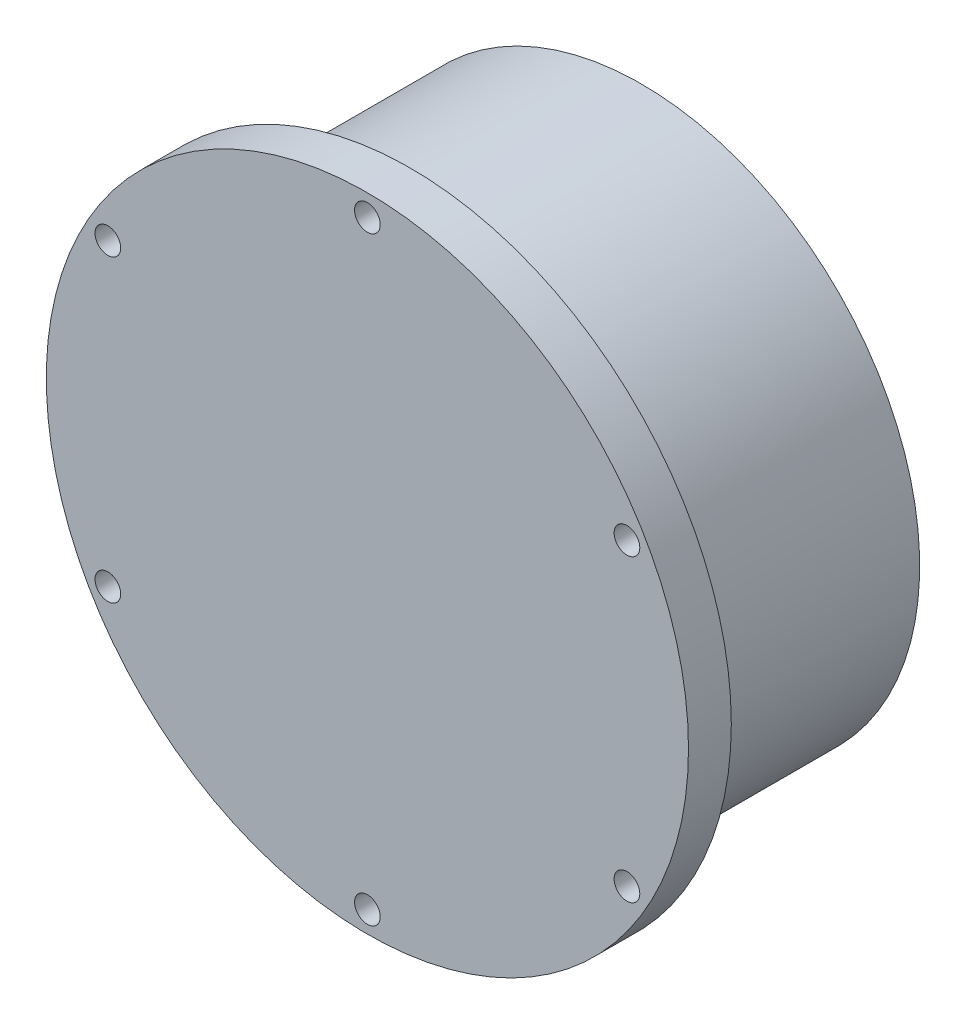
ISO-10303-21;
HEADER;
FILE_DESCRIPTION(('STEP AP214'),'2;1');
FILE_NAME('part.step','',(''),(''),'','','');
FILE_SCHEMA(('AUTOMOTIVE_DESIGN { 1 0 10303 214 1 1 1 1 }'));
ENDSEC;
DATA;
#1=APPLICATION_CONTEXT('core data for automotive mechanical design processes');
#2=APPLICATION_PROTOCOL_DEFINITION('international standard','automotive_design',2000,#1);
#3=PRODUCT_CONTEXT('',#1,'mechanical');
#4=PRODUCT('Part','Part','',(#3));
#5=PRODUCT_RELATED_PRODUCT_CATEGORY('part','',(#4));
#6=PRODUCT_DEFINITION_FORMATION('','',#4);
#7=PRODUCT_DEFINITION_CONTEXT('part definition',#1,'design');
#8=PRODUCT_DEFINITION('design','',#6,#7);
#9=PRODUCT_DEFINITION_SHAPE('','',#8);
#10=(LENGTH_UNIT() NAMED_UNIT(*) SI_UNIT(.MILLI.,.METRE.));
#11=(NAMED_UNIT(*) PLANE_ANGLE_UNIT() SI_UNIT($,.RADIAN.));
#12=(NAMED_UNIT(*) SI_UNIT($,.STERADIAN.) SOLID_ANGLE_UNIT());
#13=UNCERTAINTY_MEASURE_WITH_UNIT(LENGTH_MEASURE(1.E-05),#10,'distance_accuracy_value','');
#14=(GEOMETRIC_REPRESENTATION_CONTEXT(3) GLOBAL_UNCERTAINTY_ASSIGNED_CONTEXT((#13)) GLOBAL_UNIT_ASSIGNED_CONTEXT((#10,
#11,#12)) REPRESENTATION_CONTEXT('',''));
#15=CARTESIAN_POINT('',(0.,0.,0.));
#16=DIRECTION('',(0.,0.,1.));
#17=DIRECTION('',(1.,0.,0.));
#18=AXIS2_PLACEMENT_3D('',#15,#16,#17);
#19=CARTESIAN_POINT('',(0.,0.,5.));
#20=DIRECTION('',(0.,0.,1.));
#21=DIRECTION('',(1.,0.,0.));
#22=AXIS2_PLACEMENT_3D('',#19,#20,#21);
#23=PLANE('',#22);
#24=CARTESIAN_POINT('',(-30.3108891324529,-17.5000000000007,5.));
#25=DIRECTION('',(0.,0.,1.));
#26=DIRECTION('',(1.,0.,0.));
#27=AXIS2_PLACEMENT_3D('',#24,#25,#26);
#28=CIRCLE('',#27,1.5);
#29=CARTESIAN_POINT('',(-28.8108891324529,-17.5000000000007,5.));
#30=VERTEX_POINT('',#29);
#31=EDGE_CURVE('E71',#30,#30,#28,.T.);
#32=ORIENTED_EDGE('',*,*,#31,.F.);
#33=EDGE_LOOP('',(#32));
#34=FACE_BOUND('',#33,.T.);
#35=CARTESIAN_POINT('',(30.3108891324563,-17.4999999999984,5.));
#36=DIRECTION('',(0.,0.,1.));
#37=DIRECTION('',(1.,0.,0.));
#38=AXIS2_PLACEMENT_3D('',#35,#36,#37);
#39=CIRCLE('',#38,1.5);
#40=CARTESIAN_POINT('',(31.8108891324563,-17.4999999999984,5.));
#41=VERTEX_POINT('',#40);
#42=EDGE_CURVE('E83',#41,#41,#39,.T.);
#43=ORIENTED_EDGE('',*,*,#42,.F.);
#44=EDGE_LOOP('',(#43));
#45=FACE_BOUND('',#44,.T.);
#46=CARTESIAN_POINT('',(-2.09146765943912E-13,34.9999999999991,5.));
#47=DIRECTION('',(0.,0.,1.));
#48=DIRECTION('',(1.,0.,0.));
#49=AXIS2_PLACEMENT_3D('',#46,#47,#48);
#50=CIRCLE('',#49,1.5);
#51=CARTESIAN_POINT('',(1.49999999999979,34.9999999999991,5.));
#52=VERTEX_POINT('',#51);
#53=EDGE_CURVE('E95',#52,#52,#50,.T.);
#54=ORIENTED_EDGE('',*,*,#53,.F.);
#55=EDGE_LOOP('',(#54));
#56=FACE_BOUND('',#55,.T.);
#57=CARTESIAN_POINT('',(0.,0.,5.));
#58=DIRECTION('',(0.,0.,1.));
#59=DIRECTION('',(1.,0.,0.));
#60=AXIS2_PLACEMENT_3D('',#57,#58,#59);
#61=CIRCLE('',#60,37.5);
#62=CARTESIAN_POINT('',(37.5,0.,5.));
#63=VERTEX_POINT('',#62);
#64=EDGE_CURVE('E56',#63,#63,#61,.T.);
#65=ORIENTED_EDGE('',*,*,#64,.T.);
#66=EDGE_LOOP('',(#65));
#67=FACE_BOUND('',#66,.T.);
#68=CARTESIAN_POINT('',(30.310889132455,17.5000000000007,5.));
#69=DIRECTION('',(0.,0.,1.));
#70=DIRECTION('',(1.,0.,0.));
#71=AXIS2_PLACEMENT_3D('',#68,#69,#70);
#72=CIRCLE('',#71,1.5);
#73=CARTESIAN_POINT('',(31.810889132455,17.5000000000007,5.));
#74=VERTEX_POINT('',#73);
#75=EDGE_CURVE('E89',#74,#74,#72,.T.);
#76=ORIENTED_EDGE('',*,*,#75,.F.);
#77=EDGE_LOOP('',(#76));
#78=FACE_BOUND('',#77,.T.);
#79=CARTESIAN_POINT('',(2.33281476902976E-12,-34.9999999999991,5.));
#80=DIRECTION('',(0.,0.,1.));
#81=DIRECTION('',(1.,0.,0.));
#82=AXIS2_PLACEMENT_3D('',#79,#80,#81);
#83=CIRCLE('',#82,1.5);
#84=CARTESIAN_POINT('',(1.50000000000233,-34.9999999999991,5.));
#85=VERTEX_POINT('',#84);
#86=EDGE_CURVE('E77',#85,#85,#83,.T.);
#87=ORIENTED_EDGE('',*,*,#86,.F.);
#88=EDGE_LOOP('',(#87));
#89=FACE_BOUND('',#88,.T.);
#90=CARTESIAN_POINT('',(-30.3108891324542,17.4999999999984,5.));
#91=DIRECTION('',(0.,0.,1.));
#92=DIRECTION('',(1.,0.,0.));
#93=AXIS2_PLACEMENT_3D('',#90,#91,#92);
#94=CIRCLE('',#93,1.5);
#95=CARTESIAN_POINT('',(-28.8108891324542,17.4999999999984,5.));
#96=VERTEX_POINT('',#95);
#97=EDGE_CURVE('E65',#96,#96,#94,.T.);
#98=ORIENTED_EDGE('',*,*,#97,.F.);
#99=EDGE_LOOP('',(#98));
#100=FACE_BOUND('',#99,.T.);
#101=ADVANCED_FACE('F43',(#34,#45,#56,#67,#78,#89,#100),#23,.T.);
#102=CARTESIAN_POINT('',(0.,0.,0.));
#103=DIRECTION('',(0.,0.,1.));
#104=DIRECTION('',(1.,0.,0.));
#105=AXIS2_PLACEMENT_3D('',#102,#103,#104);
#106=PLANE('',#105);
#107=CARTESIAN_POINT('',(0.,0.,0.));
#108=DIRECTION('',(0.,0.,-1.));
#109=DIRECTION('',(-1.,0.,0.));
#110=AXIS2_PLACEMENT_3D('',#107,#108,#109);
#111=CIRCLE('',#110,32.5);
#112=CARTESIAN_POINT('',(-32.5,0.,0.));
#113=VERTEX_POINT('',#112);
#114=EDGE_CURVE('E51',#113,#113,#111,.T.);
#115=ORIENTED_EDGE('',*,*,#114,.F.);
#116=EDGE_LOOP('',(#115));
#117=FACE_BOUND('',#116,.T.);
#118=CARTESIAN_POINT('',(0.,0.,0.));
#119=DIRECTION('',(0.,0.,1.));
#120=DIRECTION('',(1.,0.,0.));
#121=AXIS2_PLACEMENT_3D('',#118,#119,#120);
#122=CIRCLE('',#121,37.5);
#123=CARTESIAN_POINT('',(37.5,0.,0.));
#124=VERTEX_POINT('',#123);
#125=EDGE_CURVE('E47',#124,#124,#122,.T.);
#126=ORIENTED_EDGE('',*,*,#125,.F.);
#127=EDGE_LOOP('',(#126));
#128=FACE_BOUND('',#127,.T.);
#129=CARTESIAN_POINT('',(-2.09146765943912E-13,34.9999999999991,0.));
#130=DIRECTION('',(0.,0.,1.));
#131=DIRECTION('',(1.,0.,0.));
#132=AXIS2_PLACEMENT_3D('',#129,#130,#131);
#133=CIRCLE('',#132,1.5);
#134=CARTESIAN_POINT('',(1.49999999999979,34.9999999999991,0.));
#135=VERTEX_POINT('',#134);
#136=EDGE_CURVE('E92',#135,#135,#133,.T.);
#137=ORIENTED_EDGE('',*,*,#136,.T.);
#138=EDGE_LOOP('',(#137));
#139=FACE_BOUND('',#138,.T.);
#140=CARTESIAN_POINT('',(30.310889132455,17.5000000000007,0.));
#141=DIRECTION('',(0.,0.,1.));
#142=DIRECTION('',(1.,0.,0.));
#143=AXIS2_PLACEMENT_3D('',#140,#141,#142);
#144=CIRCLE('',#143,1.5);
#145=CARTESIAN_POINT('',(31.810889132455,17.5000000000007,0.));
#146=VERTEX_POINT('',#145);
#147=EDGE_CURVE('E86',#146,#146,#144,.T.);
#148=ORIENTED_EDGE('',*,*,#147,.T.);
#149=EDGE_LOOP('',(#148));
#150=FACE_BOUND('',#149,.T.);
#151=CARTESIAN_POINT('',(30.3108891324563,-17.4999999999984,0.));
#152=DIRECTION('',(0.,0.,1.));
#153=DIRECTION('',(1.,0.,0.));
#154=AXIS2_PLACEMENT_3D('',#151,#152,#153);
#155=CIRCLE('',#154,1.5);
#156=CARTESIAN_POINT('',(31.8108891324563,-17.4999999999984,0.));
#157=VERTEX_POINT('',#156);
#158=EDGE_CURVE('E80',#157,#157,#155,.T.);
#159=ORIENTED_EDGE('',*,*,#158,.T.);
#160=EDGE_LOOP('',(#159));
#161=FACE_BOUND('',#160,.T.);
#162=CARTESIAN_POINT('',(2.33281476902976E-12,-34.9999999999991,0.));
#163=DIRECTION('',(0.,0.,1.));
#164=DIRECTION('',(1.,0.,0.));
#165=AXIS2_PLACEMENT_3D('',#162,#163,#164);
#166=CIRCLE('',#165,1.5);
#167=CARTESIAN_POINT('',(1.50000000000233,-34.9999999999991,0.));
#168=VERTEX_POINT('',#167);
#169=EDGE_CURVE('E74',#168,#168,#166,.T.);
#170=ORIENTED_EDGE('',*,*,#169,.T.);
#171=EDGE_LOOP('',(#170));
#172=FACE_BOUND('',#171,.T.);
#173=CARTESIAN_POINT('',(-30.3108891324529,-17.5000000000007,0.));
#174=DIRECTION('',(0.,0.,1.));
#175=DIRECTION('',(1.,0.,0.));
#176=AXIS2_PLACEMENT_3D('',#173,#174,#175);
#177=CIRCLE('',#176,1.5);
#178=CARTESIAN_POINT('',(-28.8108891324529,-17.5000000000007,0.));
#179=VERTEX_POINT('',#178);
#180=EDGE_CURVE('E68',#179,#179,#177,.T.);
#181=ORIENTED_EDGE('',*,*,#180,.T.);
#182=EDGE_LOOP('',(#181));
#183=FACE_BOUND('',#182,.T.);
#184=CARTESIAN_POINT('',(-30.3108891324542,17.4999999999984,0.));
#185=DIRECTION('',(0.,0.,1.));
#186=DIRECTION('',(1.,0.,0.));
#187=AXIS2_PLACEMENT_3D('',#184,#185,#186);
#188=CIRCLE('',#187,1.5);
#189=CARTESIAN_POINT('',(-28.8108891324542,17.4999999999984,0.));
#190=VERTEX_POINT('',#189);
#191=EDGE_CURVE('E63',#190,#190,#188,.T.);
#192=ORIENTED_EDGE('',*,*,#191,.T.);
#193=EDGE_LOOP('',(#192));
#194=FACE_BOUND('',#193,.T.);
#195=ADVANCED_FACE('F106',(#117,#128,#139,#150,#161,#172,#183,#194),#106,.F.);
#196=CARTESIAN_POINT('',(0.,0.,5.));
#197=DIRECTION('',(0.,0.,-1.));
#198=DIRECTION('',(-1.,0.,0.));
#199=AXIS2_PLACEMENT_3D('',#196,#197,#198);
#200=CYLINDRICAL_SURFACE('',#199,37.5);
#201=ORIENTED_EDGE('',*,*,#64,.F.);
#202=EDGE_LOOP('',(#201));
#203=FACE_BOUND('',#202,.T.);
#204=ORIENTED_EDGE('',*,*,#125,.T.);
#205=EDGE_LOOP('',(#204));
#206=FACE_BOUND('',#205,.T.);
#207=ADVANCED_FACE('F45',(#203,#206),#200,.T.);
#208=CARTESIAN_POINT('',(-2.09146765943912E-13,34.9999999999991,5.));
#209=DIRECTION('',(0.,0.,-1.));
#210=DIRECTION('',(-1.,0.,0.));
#211=AXIS2_PLACEMENT_3D('',#208,#209,#210);
#212=CYLINDRICAL_SURFACE('',#211,1.5);
#213=ORIENTED_EDGE('',*,*,#53,.T.);
#214=EDGE_LOOP('',(#213));
#215=FACE_BOUND('',#214,.T.);
#216=ORIENTED_EDGE('',*,*,#136,.F.);
#217=EDGE_LOOP('',(#216));
#218=FACE_BOUND('',#217,.T.);
#219=ADVANCED_FACE('F147',(#215,#218),#212,.F.);
#220=CARTESIAN_POINT('',(30.310889132455,17.5000000000007,5.));
#221=DIRECTION('',(0.,0.,-1.));
#222=DIRECTION('',(-1.,0.,0.));
#223=AXIS2_PLACEMENT_3D('',#220,#221,#222);
#224=CYLINDRICAL_SURFACE('',#223,1.5);
#225=ORIENTED_EDGE('',*,*,#75,.T.);
#226=EDGE_LOOP('',(#225));
#227=FACE_BOUND('',#226,.T.);
#228=ORIENTED_EDGE('',*,*,#147,.F.);
#229=EDGE_LOOP('',(#228));
#230=FACE_BOUND('',#229,.T.);
#231=ADVANCED_FACE('F150',(#227,#230),#224,.F.);
#232=CARTESIAN_POINT('',(30.3108891324563,-17.4999999999984,5.));
#233=DIRECTION('',(0.,0.,-1.));
#234=DIRECTION('',(-1.,0.,0.));
#235=AXIS2_PLACEMENT_3D('',#232,#233,#234);
#236=CYLINDRICAL_SURFACE('',#235,1.5);
#237=ORIENTED_EDGE('',*,*,#42,.T.);
#238=EDGE_LOOP('',(#237));
#239=FACE_BOUND('',#238,.T.);
#240=ORIENTED_EDGE('',*,*,#158,.F.);
#241=EDGE_LOOP('',(#240));
#242=FACE_BOUND('',#241,.T.);
#243=ADVANCED_FACE('F154',(#239,#242),#236,.F.);
#244=CARTESIAN_POINT('',(2.33281476902976E-12,-34.9999999999991,5.));
#245=DIRECTION('',(0.,0.,-1.));
#246=DIRECTION('',(-1.,0.,0.));
#247=AXIS2_PLACEMENT_3D('',#244,#245,#246);
#248=CYLINDRICAL_SURFACE('',#247,1.5);
#249=ORIENTED_EDGE('',*,*,#86,.T.);
#250=EDGE_LOOP('',(#249));
#251=FACE_BOUND('',#250,.T.);
#252=ORIENTED_EDGE('',*,*,#169,.F.);
#253=EDGE_LOOP('',(#252));
#254=FACE_BOUND('',#253,.T.);
#255=ADVANCED_FACE('F135',(#251,#254),#248,.F.);
#256=CARTESIAN_POINT('',(-30.3108891324529,-17.5000000000007,5.));
#257=DIRECTION('',(0.,0.,-1.));
#258=DIRECTION('',(-1.,0.,0.));
#259=AXIS2_PLACEMENT_3D('',#256,#257,#258);
#260=CYLINDRICAL_SURFACE('',#259,1.5);
#261=ORIENTED_EDGE('',*,*,#31,.T.);
#262=EDGE_LOOP('',(#261));
#263=FACE_BOUND('',#262,.T.);
#264=ORIENTED_EDGE('',*,*,#180,.F.);
#265=EDGE_LOOP('',(#264));
#266=FACE_BOUND('',#265,.T.);
#267=ADVANCED_FACE('F125',(#263,#266),#260,.F.);
#268=CARTESIAN_POINT('',(-30.3108891324542,17.4999999999984,5.));
#269=DIRECTION('',(0.,0.,-1.));
#270=DIRECTION('',(-1.,0.,0.));
#271=AXIS2_PLACEMENT_3D('',#268,#269,#270);
#272=CYLINDRICAL_SURFACE('',#271,1.5);
#273=ORIENTED_EDGE('',*,*,#97,.T.);
#274=EDGE_LOOP('',(#273));
#275=FACE_BOUND('',#274,.T.);
#276=ORIENTED_EDGE('',*,*,#191,.F.);
#277=EDGE_LOOP('',(#276));
#278=FACE_BOUND('',#277,.T.);
#279=ADVANCED_FACE('F122',(#275,#278),#272,.F.);
#280=CARTESIAN_POINT('',(0.,0.,-27.));
#281=DIRECTION('',(0.,0.,1.));
#282=DIRECTION('',(1.,0.,0.));
#283=AXIS2_PLACEMENT_3D('',#280,#281,#282);
#284=CYLINDRICAL_SURFACE('',#283,32.5);
#285=CARTESIAN_POINT('',(0.,0.,-27.));
#286=DIRECTION('',(0.,0.,-1.));
#287=DIRECTION('',(-1.,0.,0.));
#288=AXIS2_PLACEMENT_3D('',#285,#286,#287);
#289=CIRCLE('',#288,32.5);
#290=CARTESIAN_POINT('',(-32.5,0.,-27.));
#291=VERTEX_POINT('',#290);
#292=EDGE_CURVE('E61',#291,#291,#289,.T.);
#293=ORIENTED_EDGE('',*,*,#292,.F.);
#294=EDGE_LOOP('',(#293));
#295=FACE_BOUND('',#294,.T.);
#296=ORIENTED_EDGE('',*,*,#114,.T.);
#297=EDGE_LOOP('',(#296));
#298=FACE_BOUND('',#297,.T.);
#299=ADVANCED_FACE('F124',(#295,#298),#284,.T.);
#300=CARTESIAN_POINT('',(0.,0.,-27.));
#301=DIRECTION('',(0.,0.,-1.));
#302=DIRECTION('',(-1.,0.,0.));
#303=AXIS2_PLACEMENT_3D('',#300,#301,#302);
#304=PLANE('',#303);
#305=CARTESIAN_POINT('',(0.,0.,-27.));
#306=DIRECTION('',(0.,0.,-1.));
#307=DIRECTION('',(-1.,0.,0.));
#308=AXIS2_PLACEMENT_3D('',#305,#306,#307);
#309=CIRCLE('',#308,12.5);
#310=CARTESIAN_POINT('',(-12.5,0.,-27.));
#311=VERTEX_POINT('',#310);
#312=EDGE_CURVE('E10',#311,#311,#309,.T.);
#313=ORIENTED_EDGE('',*,*,#312,.F.);
#314=EDGE_LOOP('',(#313));
#315=FACE_BOUND('',#314,.T.);
#316=ORIENTED_EDGE('',*,*,#292,.T.);
#317=EDGE_LOOP('',(#316));
#318=FACE_BOUND('',#317,.T.);
#319=ADVANCED_FACE('F132',(#315,#318),#304,.T.);
#320=CARTESIAN_POINT('',(0.,0.,-34.75));
#321=DIRECTION('',(0.,0.,1.));
#322=DIRECTION('',(1.,0.,0.));
#323=AXIS2_PLACEMENT_3D('',#320,#321,#322);
#324=CYLINDRICAL_SURFACE('',#323,12.5);
#325=CARTESIAN_POINT('',(0.,0.,-34.75));
#326=DIRECTION('',(0.,0.,-1.));
#327=DIRECTION('',(-1.,0.,0.));
#328=AXIS2_PLACEMENT_3D('',#325,#326,#327);
#329=CIRCLE('',#328,12.5);
#330=CARTESIAN_POINT('',(-12.5,0.,-34.75));
#331=VERTEX_POINT('',#330);
#332=EDGE_CURVE('E60',#331,#331,#329,.T.);
#333=ORIENTED_EDGE('',*,*,#332,.F.);
#334=EDGE_LOOP('',(#333));
#335=FACE_BOUND('',#334,.T.);
#336=ORIENTED_EDGE('',*,*,#312,.T.);
#337=EDGE_LOOP('',(#336));
#338=FACE_BOUND('',#337,.T.);
#339=ADVANCED_FACE('F195',(#335,#338),#324,.T.);
#340=CARTESIAN_POINT('',(0.,0.,-34.75));
#341=DIRECTION('',(0.,0.,-1.));
#342=DIRECTION('',(-1.,0.,0.));
#343=AXIS2_PLACEMENT_3D('',#340,#341,#342);
#344=PLANE('',#343);
#345=ORIENTED_EDGE('',*,*,#332,.T.);
#346=EDGE_LOOP('',(#345));
#347=FACE_BOUND('',#346,.T.);
#348=ADVANCED_FACE('F205',(#347),#344,.T.);
#349=CLOSED_SHELL('',(#101,#195,#207,#219,#231,#243,#255,#267,#279,#299,#319,#339,#348));
#350=MANIFOLD_SOLID_BREP('B2',#349);
#351=ADVANCED_BREP_SHAPE_REPRESENTATION('',(#18,#350),#14);
#352=SHAPE_DEFINITION_REPRESENTATION(#9,#351);
ENDSEC;
END-ISO-10303-21;
